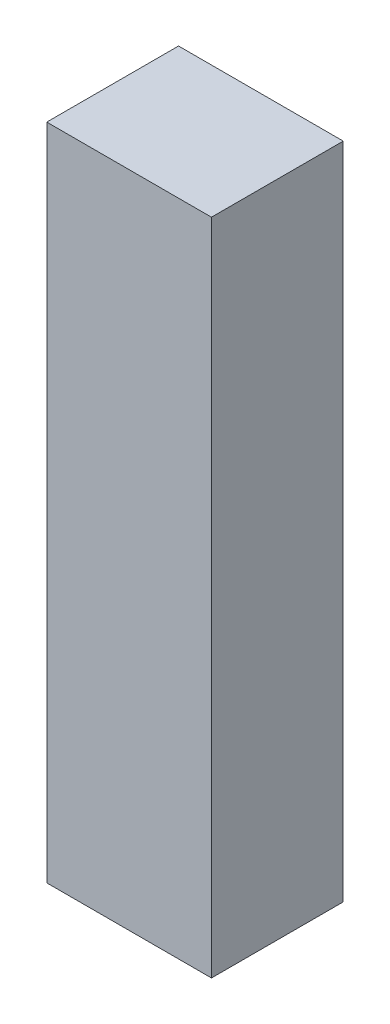
ISO-10303-21;
HEADER;
FILE_DESCRIPTION(('STEP AP214'),'2;1');
FILE_NAME('part.step','',(''),(''),'','','');
FILE_SCHEMA(('AUTOMOTIVE_DESIGN { 1 0 10303 214 1 1 1 1 }'));
ENDSEC;
DATA;
#1=APPLICATION_CONTEXT('core data for automotive mechanical design processes');
#2=APPLICATION_PROTOCOL_DEFINITION('international standard','automotive_design',2000,#1);
#3=PRODUCT_CONTEXT('',#1,'mechanical');
#4=PRODUCT('Part','Part','',(#3));
#5=PRODUCT_RELATED_PRODUCT_CATEGORY('part','',(#4));
#6=PRODUCT_DEFINITION_FORMATION('','',#4);
#7=PRODUCT_DEFINITION_CONTEXT('part definition',#1,'design');
#8=PRODUCT_DEFINITION('design','',#6,#7);
#9=PRODUCT_DEFINITION_SHAPE('','',#8);
#10=(LENGTH_UNIT() NAMED_UNIT(*) SI_UNIT(.MILLI.,.METRE.));
#11=(NAMED_UNIT(*) PLANE_ANGLE_UNIT() SI_UNIT($,.RADIAN.));
#12=(NAMED_UNIT(*) SI_UNIT($,.STERADIAN.) SOLID_ANGLE_UNIT());
#13=UNCERTAINTY_MEASURE_WITH_UNIT(LENGTH_MEASURE(1.E-05),#10,'distance_accuracy_value','');
#14=(GEOMETRIC_REPRESENTATION_CONTEXT(3) GLOBAL_UNCERTAINTY_ASSIGNED_CONTEXT((#13)) GLOBAL_UNIT_ASSIGNED_CONTEXT((#10,
#11,#12)) REPRESENTATION_CONTEXT('',''));
#15=CARTESIAN_POINT('',(0.,0.,0.));
#16=DIRECTION('',(0.,0.,1.));
#17=DIRECTION('',(1.,0.,0.));
#18=AXIS2_PLACEMENT_3D('',#15,#16,#17);
#19=CARTESIAN_POINT('',(120.,330.,-776.));
#20=DIRECTION('',(-1.,0.,0.));
#21=DIRECTION('',(0.,0.,1.));
#22=AXIS2_PLACEMENT_3D('',#19,#20,#21);
#23=PLANE('',#22);
#24=DIRECTION('',(0.,-1.,0.));
#25=VECTOR('',#24,1.);
#26=CARTESIAN_POINT('',(120.,330.,-736.));
#27=LINE('',#26,#25);
#28=CARTESIAN_POINT('',(120.,530.,-736.));
#29=VERTEX_POINT('',#28);
#30=CARTESIAN_POINT('',(120.,330.,-736.));
#31=VERTEX_POINT('',#30);
#32=EDGE_CURVE('E103',#29,#31,#27,.T.);
#33=ORIENTED_EDGE('',*,*,#32,.F.);
#34=DIRECTION('',(0.,0.,1.));
#35=VECTOR('',#34,1.);
#36=CARTESIAN_POINT('',(120.,530.,-776.));
#37=LINE('',#36,#35);
#38=CARTESIAN_POINT('',(120.,530.,-776.));
#39=VERTEX_POINT('',#38);
#40=EDGE_CURVE('E11',#39,#29,#37,.T.);
#41=ORIENTED_EDGE('',*,*,#40,.F.);
#42=DIRECTION('',(0.,-1.,0.));
#43=VECTOR('',#42,1.);
#44=CARTESIAN_POINT('',(120.,330.,-776.));
#45=LINE('',#44,#43);
#46=CARTESIAN_POINT('',(120.,330.,-776.));
#47=VERTEX_POINT('',#46);
#48=EDGE_CURVE('E97',#39,#47,#45,.T.);
#49=ORIENTED_EDGE('',*,*,#48,.T.);
#50=DIRECTION('',(0.,0.,1.));
#51=VECTOR('',#50,1.);
#52=CARTESIAN_POINT('',(120.,330.,-776.));
#53=LINE('',#52,#51);
#54=EDGE_CURVE('E42',#47,#31,#53,.T.);
#55=ORIENTED_EDGE('',*,*,#54,.T.);
#56=EDGE_LOOP('',(#33,#41,#49,#55));
#57=FACE_BOUND('',#56,.T.);
#58=ADVANCED_FACE('F39',(#57),#23,.T.);
#59=CARTESIAN_POINT('',(120.,530.,-776.));
#60=DIRECTION('',(0.,1.,0.));
#61=DIRECTION('',(0.,0.,1.));
#62=AXIS2_PLACEMENT_3D('',#59,#60,#61);
#63=PLANE('',#62);
#64=DIRECTION('',(-1.,0.,0.));
#65=VECTOR('',#64,1.);
#66=CARTESIAN_POINT('',(120.,530.,-736.));
#67=LINE('',#66,#65);
#68=CARTESIAN_POINT('',(170.,530.,-736.));
#69=VERTEX_POINT('',#68);
#70=EDGE_CURVE('E99',#69,#29,#67,.T.);
#71=ORIENTED_EDGE('',*,*,#70,.F.);
#72=DIRECTION('',(0.,0.,1.));
#73=VECTOR('',#72,1.);
#74=CARTESIAN_POINT('',(170.,530.,-776.));
#75=LINE('',#74,#73);
#76=CARTESIAN_POINT('',(170.,530.,-776.));
#77=VERTEX_POINT('',#76);
#78=EDGE_CURVE('E48',#77,#69,#75,.T.);
#79=ORIENTED_EDGE('',*,*,#78,.F.);
#80=DIRECTION('',(-1.,0.,0.));
#81=VECTOR('',#80,1.);
#82=CARTESIAN_POINT('',(120.,530.,-776.));
#83=LINE('',#82,#81);
#84=EDGE_CURVE('E94',#77,#39,#83,.T.);
#85=ORIENTED_EDGE('',*,*,#84,.T.);
#86=ORIENTED_EDGE('',*,*,#40,.T.);
#87=EDGE_LOOP('',(#71,#79,#85,#86));
#88=FACE_BOUND('',#87,.T.);
#89=ADVANCED_FACE('F113',(#88),#63,.T.);
#90=CARTESIAN_POINT('',(170.,330.,-776.));
#91=DIRECTION('',(1.,0.,0.));
#92=DIRECTION('',(0.,0.,-1.));
#93=AXIS2_PLACEMENT_3D('',#90,#91,#92);
#94=PLANE('',#93);
#95=DIRECTION('',(0.,1.,0.));
#96=VECTOR('',#95,1.);
#97=CARTESIAN_POINT('',(170.,330.,-736.));
#98=LINE('',#97,#96);
#99=CARTESIAN_POINT('',(170.,330.,-736.));
#100=VERTEX_POINT('',#99);
#101=EDGE_CURVE('E89',#100,#69,#98,.T.);
#102=ORIENTED_EDGE('',*,*,#101,.F.);
#103=DIRECTION('',(0.,0.,1.));
#104=VECTOR('',#103,1.);
#105=CARTESIAN_POINT('',(170.,330.,-776.));
#106=LINE('',#105,#104);
#107=CARTESIAN_POINT('',(170.,330.,-776.));
#108=VERTEX_POINT('',#107);
#109=EDGE_CURVE('E84',#108,#100,#106,.T.);
#110=ORIENTED_EDGE('',*,*,#109,.F.);
#111=DIRECTION('',(0.,1.,0.));
#112=VECTOR('',#111,1.);
#113=CARTESIAN_POINT('',(170.,330.,-776.));
#114=LINE('',#113,#112);
#115=EDGE_CURVE('E87',#108,#77,#114,.T.);
#116=ORIENTED_EDGE('',*,*,#115,.T.);
#117=ORIENTED_EDGE('',*,*,#78,.T.);
#118=EDGE_LOOP('',(#102,#110,#116,#117));
#119=FACE_BOUND('',#118,.T.);
#120=ADVANCED_FACE('F86',(#119),#94,.T.);
#121=CARTESIAN_POINT('',(120.,330.,-776.));
#122=DIRECTION('',(0.,-1.,0.));
#123=DIRECTION('',(0.,0.,-1.));
#124=AXIS2_PLACEMENT_3D('',#121,#122,#123);
#125=PLANE('',#124);
#126=DIRECTION('',(1.,0.,0.));
#127=VECTOR('',#126,1.);
#128=CARTESIAN_POINT('',(120.,330.,-736.));
#129=LINE('',#128,#127);
#130=EDGE_CURVE('E106',#31,#100,#129,.T.);
#131=ORIENTED_EDGE('',*,*,#130,.F.);
#132=ORIENTED_EDGE('',*,*,#54,.F.);
#133=DIRECTION('',(1.,0.,0.));
#134=VECTOR('',#133,1.);
#135=CARTESIAN_POINT('',(120.,330.,-776.));
#136=LINE('',#135,#134);
#137=EDGE_CURVE('E93',#47,#108,#136,.T.);
#138=ORIENTED_EDGE('',*,*,#137,.T.);
#139=ORIENTED_EDGE('',*,*,#109,.T.);
#140=EDGE_LOOP('',(#131,#132,#138,#139));
#141=FACE_BOUND('',#140,.T.);
#142=ADVANCED_FACE('F96',(#141),#125,.T.);
#143=CARTESIAN_POINT('',(0.,0.,-776.));
#144=DIRECTION('',(0.,0.,-1.));
#145=DIRECTION('',(-1.,0.,0.));
#146=AXIS2_PLACEMENT_3D('',#143,#144,#145);
#147=PLANE('',#146);
#148=ORIENTED_EDGE('',*,*,#48,.F.);
#149=ORIENTED_EDGE('',*,*,#84,.F.);
#150=ORIENTED_EDGE('',*,*,#115,.F.);
#151=ORIENTED_EDGE('',*,*,#137,.F.);
#152=EDGE_LOOP('',(#148,#149,#150,#151));
#153=FACE_BOUND('',#152,.T.);
#154=ADVANCED_FACE('F92',(#153),#147,.T.);
#155=CARTESIAN_POINT('',(0.,0.,-736.));
#156=DIRECTION('',(0.,0.,-1.));
#157=DIRECTION('',(-1.,0.,0.));
#158=AXIS2_PLACEMENT_3D('',#155,#156,#157);
#159=PLANE('',#158);
#160=ORIENTED_EDGE('',*,*,#32,.T.);
#161=ORIENTED_EDGE('',*,*,#130,.T.);
#162=ORIENTED_EDGE('',*,*,#101,.T.);
#163=ORIENTED_EDGE('',*,*,#70,.T.);
#164=EDGE_LOOP('',(#160,#161,#162,#163));
#165=FACE_BOUND('',#164,.T.);
#166=ADVANCED_FACE('F112',(#165),#159,.F.);
#167=CLOSED_SHELL('',(#58,#89,#120,#142,#154,#166));
#168=MANIFOLD_SOLID_BREP('B2',#167);
#169=ADVANCED_BREP_SHAPE_REPRESENTATION('',(#18,#168),#14);
#170=SHAPE_DEFINITION_REPRESENTATION(#9,#169);
ENDSEC;
END-ISO-10303-21;
